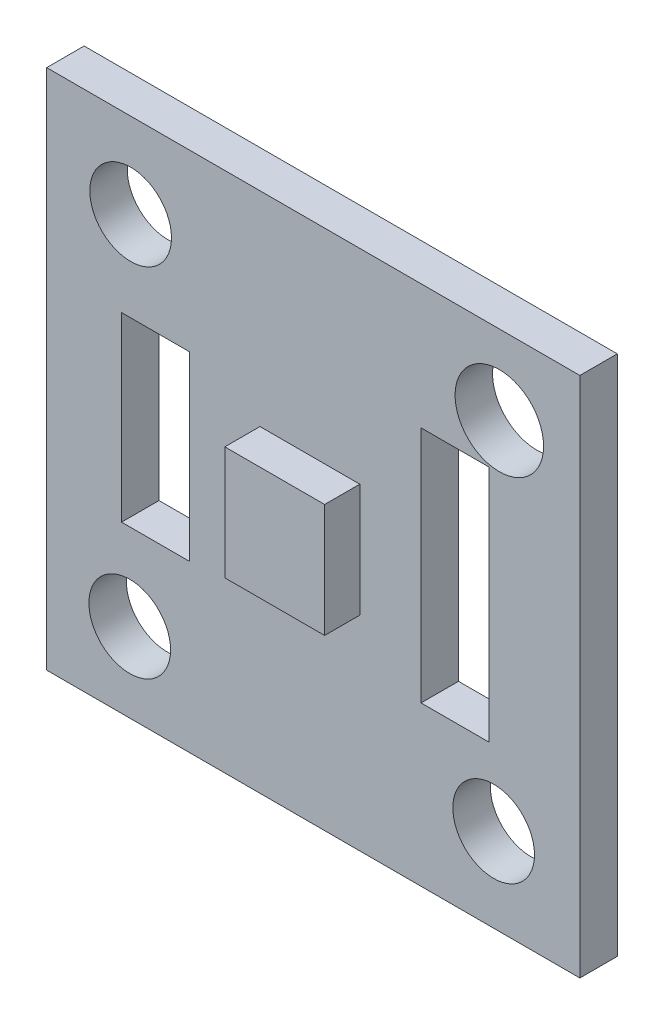
ISO-10303-21;
HEADER;
FILE_DESCRIPTION(('STEP AP214'),'2;1');
FILE_NAME('part.step','',(''),(''),'','','');
FILE_SCHEMA(('AUTOMOTIVE_DESIGN { 1 0 10303 214 1 1 1 1 }'));
ENDSEC;
DATA;
#1=APPLICATION_CONTEXT('core data for automotive mechanical design processes');
#2=APPLICATION_PROTOCOL_DEFINITION('international standard','automotive_design',2000,#1);
#3=PRODUCT_CONTEXT('',#1,'mechanical');
#4=PRODUCT('Part','Part','',(#3));
#5=PRODUCT_RELATED_PRODUCT_CATEGORY('part','',(#4));
#6=PRODUCT_DEFINITION_FORMATION('','',#4);
#7=PRODUCT_DEFINITION_CONTEXT('part definition',#1,'design');
#8=PRODUCT_DEFINITION('design','',#6,#7);
#9=PRODUCT_DEFINITION_SHAPE('','',#8);
#10=(LENGTH_UNIT() NAMED_UNIT(*) SI_UNIT(.MILLI.,.METRE.));
#11=(NAMED_UNIT(*) PLANE_ANGLE_UNIT() SI_UNIT($,.RADIAN.));
#12=(NAMED_UNIT(*) SI_UNIT($,.STERADIAN.) SOLID_ANGLE_UNIT());
#13=UNCERTAINTY_MEASURE_WITH_UNIT(LENGTH_MEASURE(1.E-05),#10,'distance_accuracy_value','');
#14=(GEOMETRIC_REPRESENTATION_CONTEXT(3) GLOBAL_UNCERTAINTY_ASSIGNED_CONTEXT((#13)) GLOBAL_UNIT_ASSIGNED_CONTEXT((#10,
#11,#12)) REPRESENTATION_CONTEXT('',''));
#15=CARTESIAN_POINT('',(0.,0.,0.));
#16=DIRECTION('',(0.,0.,1.));
#17=DIRECTION('',(1.,0.,0.));
#18=AXIS2_PLACEMENT_3D('',#15,#16,#17);
#19=CARTESIAN_POINT('',(0.,0.,1.65));
#20=DIRECTION('',(0.,0.,-1.));
#21=DIRECTION('',(-1.,0.,0.));
#22=AXIS2_PLACEMENT_3D('',#19,#20,#21);
#23=PLANE('',#22);
#24=CARTESIAN_POINT('',(3.65999999999999,3.5,1.65));
#25=DIRECTION('',(0.,0.,1.));
#26=DIRECTION('',(1.,0.,0.));
#27=AXIS2_PLACEMENT_3D('',#24,#25,#26);
#28=CIRCLE('',#27,1.8);
#29=CARTESIAN_POINT('',(5.45999999999999,3.5,1.65));
#30=VERTEX_POINT('',#29);
#31=EDGE_CURVE('E510',#30,#30,#28,.T.);
#32=ORIENTED_EDGE('',*,*,#31,.F.);
#33=EDGE_LOOP('',(#32));
#34=FACE_BOUND('',#33,.T.);
#35=CARTESIAN_POINT('',(19.7,3.7,1.65));
#36=DIRECTION('',(0.,0.,1.));
#37=DIRECTION('',(1.,0.,0.));
#38=AXIS2_PLACEMENT_3D('',#35,#36,#37);
#39=CIRCLE('',#38,1.8);
#40=CARTESIAN_POINT('',(21.5,3.7,1.65));
#41=VERTEX_POINT('',#40);
#42=EDGE_CURVE('E514',#41,#41,#39,.T.);
#43=ORIENTED_EDGE('',*,*,#42,.F.);
#44=EDGE_LOOP('',(#43));
#45=FACE_BOUND('',#44,.T.);
#46=CARTESIAN_POINT('',(19.95,19.5,1.65));
#47=DIRECTION('',(0.,0.,1.));
#48=DIRECTION('',(1.,0.,0.));
#49=AXIS2_PLACEMENT_3D('',#46,#47,#48);
#50=CIRCLE('',#49,1.95);
#51=CARTESIAN_POINT('',(21.9,19.5,1.65));
#52=VERTEX_POINT('',#51);
#53=EDGE_CURVE('E524',#52,#52,#50,.T.);
#54=ORIENTED_EDGE('',*,*,#53,.F.);
#55=EDGE_LOOP('',(#54));
#56=FACE_BOUND('',#55,.T.);
#57=CARTESIAN_POINT('',(3.69999999999999,19.25,1.65));
#58=DIRECTION('',(0.,0.,1.));
#59=DIRECTION('',(1.,0.,0.));
#60=AXIS2_PLACEMENT_3D('',#57,#58,#59);
#61=CIRCLE('',#60,1.8);
#62=CARTESIAN_POINT('',(5.49999999999999,19.25,1.65));
#63=VERTEX_POINT('',#62);
#64=EDGE_CURVE('E519',#63,#63,#61,.T.);
#65=ORIENTED_EDGE('',*,*,#64,.F.);
#66=EDGE_LOOP('',(#65));
#67=FACE_BOUND('',#66,.T.);
#68=DIRECTION('',(1.,0.,0.));
#69=VECTOR('',#68,1.);
#70=CARTESIAN_POINT('',(3.29999999999999,7.3,1.65));
#71=LINE('',#70,#69);
#72=CARTESIAN_POINT('',(3.29999999999999,7.3,1.65));
#73=VERTEX_POINT('',#72);
#74=CARTESIAN_POINT('',(6.29999999999999,7.3,1.65));
#75=VERTEX_POINT('',#74);
#76=EDGE_CURVE('E165',#73,#75,#71,.T.);
#77=ORIENTED_EDGE('',*,*,#76,.F.);
#78=DIRECTION('',(0.,-1.,0.));
#79=VECTOR('',#78,1.);
#80=CARTESIAN_POINT('',(3.29999999999999,15.3,1.65));
#81=LINE('',#80,#79);
#82=CARTESIAN_POINT('',(3.29999999999999,15.3,1.65));
#83=VERTEX_POINT('',#82);
#84=EDGE_CURVE('E48',#83,#73,#81,.T.);
#85=ORIENTED_EDGE('',*,*,#84,.F.);
#86=DIRECTION('',(-1.,0.,0.));
#87=VECTOR('',#86,1.);
#88=CARTESIAN_POINT('',(3.29999999999999,15.3,1.65));
#89=LINE('',#88,#87);
#90=CARTESIAN_POINT('',(6.29999999999999,15.3,1.65));
#91=VERTEX_POINT('',#90);
#92=EDGE_CURVE('E158',#91,#83,#89,.T.);
#93=ORIENTED_EDGE('',*,*,#92,.F.);
#94=DIRECTION('',(0.,1.,0.));
#95=VECTOR('',#94,1.);
#96=CARTESIAN_POINT('',(6.29999999999999,15.3,1.65));
#97=LINE('',#96,#95);
#98=EDGE_CURVE('E172',#75,#91,#97,.T.);
#99=ORIENTED_EDGE('',*,*,#98,.F.);
#100=EDGE_LOOP('',(#77,#85,#93,#99));
#101=FACE_BOUND('',#100,.T.);
#102=DIRECTION('',(1.,0.,0.));
#103=VECTOR('',#102,1.);
#104=CARTESIAN_POINT('',(16.5,7.,1.65));
#105=LINE('',#104,#103);
#106=CARTESIAN_POINT('',(16.5,7.,1.65));
#107=VERTEX_POINT('',#106);
#108=CARTESIAN_POINT('',(19.5,7.,1.65));
#109=VERTEX_POINT('',#108);
#110=EDGE_CURVE('E191',#107,#109,#105,.T.);
#111=ORIENTED_EDGE('',*,*,#110,.F.);
#112=DIRECTION('',(0.,-1.,0.));
#113=VECTOR('',#112,1.);
#114=CARTESIAN_POINT('',(16.5,17.5,1.65));
#115=LINE('',#114,#113);
#116=CARTESIAN_POINT('',(16.5,17.5,1.65));
#117=VERTEX_POINT('',#116);
#118=EDGE_CURVE('E189',#117,#107,#115,.T.);
#119=ORIENTED_EDGE('',*,*,#118,.F.);
#120=DIRECTION('',(-1.,0.,0.));
#121=VECTOR('',#120,1.);
#122=CARTESIAN_POINT('',(16.5,17.5,1.65));
#123=LINE('',#122,#121);
#124=CARTESIAN_POINT('',(19.5,17.5,1.65));
#125=VERTEX_POINT('',#124);
#126=EDGE_CURVE('E197',#125,#117,#123,.T.);
#127=ORIENTED_EDGE('',*,*,#126,.F.);
#128=DIRECTION('',(0.,1.,0.));
#129=VECTOR('',#128,1.);
#130=CARTESIAN_POINT('',(19.5,17.5,1.65));
#131=LINE('',#130,#129);
#132=EDGE_CURVE('E194',#109,#125,#131,.T.);
#133=ORIENTED_EDGE('',*,*,#132,.F.);
#134=EDGE_LOOP('',(#111,#119,#127,#133));
#135=FACE_BOUND('',#134,.T.);
#136=DIRECTION('',(0.,-1.,0.));
#137=VECTOR('',#136,1.);
#138=CARTESIAN_POINT('',(0.,0.,1.65));
#139=LINE('',#138,#137);
#140=CARTESIAN_POINT('',(0.,23.,1.65));
#141=VERTEX_POINT('',#140);
#142=CARTESIAN_POINT('',(0.,0.,1.65));
#143=VERTEX_POINT('',#142);
#144=EDGE_CURVE('E246',#141,#143,#139,.T.);
#145=ORIENTED_EDGE('',*,*,#144,.T.);
#146=DIRECTION('',(1.,0.,0.));
#147=VECTOR('',#146,1.);
#148=CARTESIAN_POINT('',(0.,0.,1.65));
#149=LINE('',#148,#147);
#150=CARTESIAN_POINT('',(23.5,0.,1.65));
#151=VERTEX_POINT('',#150);
#152=EDGE_CURVE('E249',#143,#151,#149,.T.);
#153=ORIENTED_EDGE('',*,*,#152,.T.);
#154=DIRECTION('',(0.,1.,0.));
#155=VECTOR('',#154,1.);
#156=CARTESIAN_POINT('',(23.5,0.,1.65));
#157=LINE('',#156,#155);
#158=CARTESIAN_POINT('',(23.5,23.,1.65));
#159=VERTEX_POINT('',#158);
#160=EDGE_CURVE('E252',#151,#159,#157,.T.);
#161=ORIENTED_EDGE('',*,*,#160,.T.);
#162=DIRECTION('',(-1.,0.,0.));
#163=VECTOR('',#162,1.);
#164=CARTESIAN_POINT('',(0.,23.,1.65));
#165=LINE('',#164,#163);
#166=EDGE_CURVE('E254',#159,#141,#165,.T.);
#167=ORIENTED_EDGE('',*,*,#166,.T.);
#168=EDGE_LOOP('',(#145,#153,#161,#167));
#169=FACE_BOUND('',#168,.T.);
#170=DIRECTION('',(0.,-1.,0.));
#171=VECTOR('',#170,1.);
#172=CARTESIAN_POINT('',(9.4,14.,1.65));
#173=LINE('',#172,#171);
#174=CARTESIAN_POINT('',(9.4,14.,1.65));
#175=VERTEX_POINT('',#174);
#176=CARTESIAN_POINT('',(9.4,9.,1.65));
#177=VERTEX_POINT('',#176);
#178=EDGE_CURVE('E212',#175,#177,#173,.T.);
#179=ORIENTED_EDGE('',*,*,#178,.F.);
#180=DIRECTION('',(-1.,0.,0.));
#181=VECTOR('',#180,1.);
#182=CARTESIAN_POINT('',(9.4,14.,1.65));
#183=LINE('',#182,#181);
#184=CARTESIAN_POINT('',(13.8,14.,1.65));
#185=VERTEX_POINT('',#184);
#186=EDGE_CURVE('E217',#185,#175,#183,.T.);
#187=ORIENTED_EDGE('',*,*,#186,.F.);
#188=DIRECTION('',(0.,1.,0.));
#189=VECTOR('',#188,1.);
#190=CARTESIAN_POINT('',(13.8,14.,1.65));
#191=LINE('',#190,#189);
#192=CARTESIAN_POINT('',(13.8,9.,1.65));
#193=VERTEX_POINT('',#192);
#194=EDGE_CURVE('E229',#193,#185,#191,.T.);
#195=ORIENTED_EDGE('',*,*,#194,.F.);
#196=DIRECTION('',(1.,0.,0.));
#197=VECTOR('',#196,1.);
#198=CARTESIAN_POINT('',(9.4,9.,1.65));
#199=LINE('',#198,#197);
#200=EDGE_CURVE('E226',#177,#193,#199,.T.);
#201=ORIENTED_EDGE('',*,*,#200,.F.);
#202=EDGE_LOOP('',(#179,#187,#195,#201));
#203=FACE_BOUND('',#202,.T.);
#204=ADVANCED_FACE('F33',(#34,#45,#56,#67,#101,#135,#169,#203),#23,.F.);
#205=CARTESIAN_POINT('',(0.,0.,1.65));
#206=DIRECTION('',(1.,0.,0.));
#207=DIRECTION('',(0.,1.,0.));
#208=AXIS2_PLACEMENT_3D('',#205,#206,#207);
#209=PLANE('',#208);
#210=DIRECTION('',(0.,-1.,0.));
#211=VECTOR('',#210,1.);
#212=CARTESIAN_POINT('',(0.,0.,0.));
#213=LINE('',#212,#211);
#214=CARTESIAN_POINT('',(0.,23.,0.));
#215=VERTEX_POINT('',#214);
#216=CARTESIAN_POINT('',(0.,0.,0.));
#217=VERTEX_POINT('',#216);
#218=EDGE_CURVE('E245',#215,#217,#213,.T.);
#219=ORIENTED_EDGE('',*,*,#218,.T.);
#220=DIRECTION('',(0.,0.,-1.));
#221=VECTOR('',#220,1.);
#222=CARTESIAN_POINT('',(0.,0.,1.65));
#223=LINE('',#222,#221);
#224=EDGE_CURVE('E11',#143,#217,#223,.T.);
#225=ORIENTED_EDGE('',*,*,#224,.F.);
#226=ORIENTED_EDGE('',*,*,#144,.F.);
#227=DIRECTION('',(0.,0.,-1.));
#228=VECTOR('',#227,1.);
#229=CARTESIAN_POINT('',(0.,23.,1.65));
#230=LINE('',#229,#228);
#231=EDGE_CURVE('E256',#141,#215,#230,.T.);
#232=ORIENTED_EDGE('',*,*,#231,.T.);
#233=EDGE_LOOP('',(#219,#225,#226,#232));
#234=FACE_BOUND('',#233,.T.);
#235=ADVANCED_FACE('F35',(#234),#209,.F.);
#236=CARTESIAN_POINT('',(0.,0.,1.65));
#237=DIRECTION('',(0.,1.,0.));
#238=DIRECTION('',(0.,0.,1.));
#239=AXIS2_PLACEMENT_3D('',#236,#237,#238);
#240=PLANE('',#239);
#241=DIRECTION('',(1.,0.,0.));
#242=VECTOR('',#241,1.);
#243=CARTESIAN_POINT('',(0.,0.,0.));
#244=LINE('',#243,#242);
#245=CARTESIAN_POINT('',(23.5,0.,0.));
#246=VERTEX_POINT('',#245);
#247=EDGE_CURVE('E259',#217,#246,#244,.T.);
#248=ORIENTED_EDGE('',*,*,#247,.T.);
#249=DIRECTION('',(0.,0.,-1.));
#250=VECTOR('',#249,1.);
#251=CARTESIAN_POINT('',(23.5,0.,1.65));
#252=LINE('',#251,#250);
#253=EDGE_CURVE('E41',#151,#246,#252,.T.);
#254=ORIENTED_EDGE('',*,*,#253,.F.);
#255=ORIENTED_EDGE('',*,*,#152,.F.);
#256=ORIENTED_EDGE('',*,*,#224,.T.);
#257=EDGE_LOOP('',(#248,#254,#255,#256));
#258=FACE_BOUND('',#257,.T.);
#259=ADVANCED_FACE('F288',(#258),#240,.F.);
#260=CARTESIAN_POINT('',(23.5,0.,1.65));
#261=DIRECTION('',(-1.,0.,0.));
#262=DIRECTION('',(0.,-1.,0.));
#263=AXIS2_PLACEMENT_3D('',#260,#261,#262);
#264=PLANE('',#263);
#265=DIRECTION('',(0.,1.,0.));
#266=VECTOR('',#265,1.);
#267=CARTESIAN_POINT('',(23.5,0.,0.));
#268=LINE('',#267,#266);
#269=CARTESIAN_POINT('',(23.5,23.,0.));
#270=VERTEX_POINT('',#269);
#271=EDGE_CURVE('E261',#246,#270,#268,.T.);
#272=ORIENTED_EDGE('',*,*,#271,.T.);
#273=DIRECTION('',(0.,0.,-1.));
#274=VECTOR('',#273,1.);
#275=CARTESIAN_POINT('',(23.5,23.,1.65));
#276=LINE('',#275,#274);
#277=EDGE_CURVE('E266',#159,#270,#276,.T.);
#278=ORIENTED_EDGE('',*,*,#277,.F.);
#279=ORIENTED_EDGE('',*,*,#160,.F.);
#280=ORIENTED_EDGE('',*,*,#253,.T.);
#281=EDGE_LOOP('',(#272,#278,#279,#280));
#282=FACE_BOUND('',#281,.T.);
#283=ADVANCED_FACE('F273',(#282),#264,.F.);
#284=CARTESIAN_POINT('',(0.,23.,1.65));
#285=DIRECTION('',(0.,-1.,0.));
#286=DIRECTION('',(0.,0.,-1.));
#287=AXIS2_PLACEMENT_3D('',#284,#285,#286);
#288=PLANE('',#287);
#289=DIRECTION('',(-1.,0.,0.));
#290=VECTOR('',#289,1.);
#291=CARTESIAN_POINT('',(0.,23.,0.));
#292=LINE('',#291,#290);
#293=EDGE_CURVE('E250',#270,#215,#292,.T.);
#294=ORIENTED_EDGE('',*,*,#293,.T.);
#295=ORIENTED_EDGE('',*,*,#231,.F.);
#296=ORIENTED_EDGE('',*,*,#166,.F.);
#297=ORIENTED_EDGE('',*,*,#277,.T.);
#298=EDGE_LOOP('',(#294,#295,#296,#297));
#299=FACE_BOUND('',#298,.T.);
#300=ADVANCED_FACE('F281',(#299),#288,.F.);
#301=CARTESIAN_POINT('',(0.,0.,0.));
#302=DIRECTION('',(0.,0.,-1.));
#303=DIRECTION('',(-1.,0.,0.));
#304=AXIS2_PLACEMENT_3D('',#301,#302,#303);
#305=PLANE('',#304);
#306=CARTESIAN_POINT('',(3.65999999999999,3.5,0.));
#307=DIRECTION('',(0.,0.,-1.));
#308=DIRECTION('',(-1.,0.,0.));
#309=AXIS2_PLACEMENT_3D('',#306,#307,#308);
#310=CIRCLE('',#309,1.8);
#311=CARTESIAN_POINT('',(5.45999999999999,3.5,0.));
#312=VERTEX_POINT('',#311);
#313=EDGE_CURVE('E508',#312,#312,#310,.F.);
#314=ORIENTED_EDGE('',*,*,#313,.T.);
#315=EDGE_LOOP('',(#314));
#316=FACE_BOUND('',#315,.T.);
#317=CARTESIAN_POINT('',(19.7,3.7,0.));
#318=DIRECTION('',(0.,0.,-1.));
#319=DIRECTION('',(-1.,0.,0.));
#320=AXIS2_PLACEMENT_3D('',#317,#318,#319);
#321=CIRCLE('',#320,1.8);
#322=CARTESIAN_POINT('',(21.5,3.7,0.));
#323=VERTEX_POINT('',#322);
#324=EDGE_CURVE('E511',#323,#323,#321,.F.);
#325=ORIENTED_EDGE('',*,*,#324,.T.);
#326=EDGE_LOOP('',(#325));
#327=FACE_BOUND('',#326,.T.);
#328=CARTESIAN_POINT('',(19.95,19.5,0.));
#329=DIRECTION('',(0.,0.,-1.));
#330=DIRECTION('',(-1.,0.,0.));
#331=AXIS2_PLACEMENT_3D('',#328,#329,#330);
#332=CIRCLE('',#331,1.95);
#333=CARTESIAN_POINT('',(21.9,19.5,0.));
#334=VERTEX_POINT('',#333);
#335=EDGE_CURVE('E541',#334,#334,#332,.F.);
#336=ORIENTED_EDGE('',*,*,#335,.T.);
#337=EDGE_LOOP('',(#336));
#338=FACE_BOUND('',#337,.T.);
#339=CARTESIAN_POINT('',(3.69999999999999,19.25,0.));
#340=DIRECTION('',(0.,0.,-1.));
#341=DIRECTION('',(-1.,0.,0.));
#342=AXIS2_PLACEMENT_3D('',#339,#340,#341);
#343=CIRCLE('',#342,1.8);
#344=CARTESIAN_POINT('',(5.49999999999999,19.25,0.));
#345=VERTEX_POINT('',#344);
#346=EDGE_CURVE('E522',#345,#345,#343,.F.);
#347=ORIENTED_EDGE('',*,*,#346,.T.);
#348=EDGE_LOOP('',(#347));
#349=FACE_BOUND('',#348,.T.);
#350=DIRECTION('',(0.,-1.,0.));
#351=VECTOR('',#350,1.);
#352=CARTESIAN_POINT('',(3.29999999999999,15.3,0.));
#353=LINE('',#352,#351);
#354=CARTESIAN_POINT('',(3.29999999999999,15.3,0.));
#355=VERTEX_POINT('',#354);
#356=CARTESIAN_POINT('',(3.29999999999999,7.3,0.));
#357=VERTEX_POINT('',#356);
#358=EDGE_CURVE('E156',#355,#357,#353,.T.);
#359=ORIENTED_EDGE('',*,*,#358,.T.);
#360=DIRECTION('',(1.,0.,0.));
#361=VECTOR('',#360,1.);
#362=CARTESIAN_POINT('',(3.29999999999999,7.3,0.));
#363=LINE('',#362,#361);
#364=CARTESIAN_POINT('',(6.29999999999999,7.3,0.));
#365=VERTEX_POINT('',#364);
#366=EDGE_CURVE('E145',#357,#365,#363,.T.);
#367=ORIENTED_EDGE('',*,*,#366,.T.);
#368=DIRECTION('',(0.,1.,0.));
#369=VECTOR('',#368,1.);
#370=CARTESIAN_POINT('',(6.29999999999999,15.3,0.));
#371=LINE('',#370,#369);
#372=CARTESIAN_POINT('',(6.29999999999999,15.3,0.));
#373=VERTEX_POINT('',#372);
#374=EDGE_CURVE('E167',#365,#373,#371,.T.);
#375=ORIENTED_EDGE('',*,*,#374,.T.);
#376=DIRECTION('',(-1.,0.,0.));
#377=VECTOR('',#376,1.);
#378=CARTESIAN_POINT('',(3.29999999999999,15.3,0.));
#379=LINE('',#378,#377);
#380=EDGE_CURVE('E163',#373,#355,#379,.T.);
#381=ORIENTED_EDGE('',*,*,#380,.T.);
#382=EDGE_LOOP('',(#359,#367,#375,#381));
#383=FACE_BOUND('',#382,.T.);
#384=DIRECTION('',(0.,-1.,0.));
#385=VECTOR('',#384,1.);
#386=CARTESIAN_POINT('',(16.5,17.5,0.));
#387=LINE('',#386,#385);
#388=CARTESIAN_POINT('',(16.5,17.5,0.));
#389=VERTEX_POINT('',#388);
#390=CARTESIAN_POINT('',(16.5,7.,0.));
#391=VERTEX_POINT('',#390);
#392=EDGE_CURVE('E186',#389,#391,#387,.T.);
#393=ORIENTED_EDGE('',*,*,#392,.T.);
#394=DIRECTION('',(1.,0.,0.));
#395=VECTOR('',#394,1.);
#396=CARTESIAN_POINT('',(16.5,7.,0.));
#397=LINE('',#396,#395);
#398=CARTESIAN_POINT('',(19.5,7.,0.));
#399=VERTEX_POINT('',#398);
#400=EDGE_CURVE('E203',#391,#399,#397,.T.);
#401=ORIENTED_EDGE('',*,*,#400,.T.);
#402=DIRECTION('',(0.,1.,0.));
#403=VECTOR('',#402,1.);
#404=CARTESIAN_POINT('',(19.5,17.5,0.));
#405=LINE('',#404,#403);
#406=CARTESIAN_POINT('',(19.5,17.5,0.));
#407=VERTEX_POINT('',#406);
#408=EDGE_CURVE('E152',#399,#407,#405,.T.);
#409=ORIENTED_EDGE('',*,*,#408,.T.);
#410=DIRECTION('',(-1.,0.,0.));
#411=VECTOR('',#410,1.);
#412=CARTESIAN_POINT('',(16.5,17.5,0.));
#413=LINE('',#412,#411);
#414=EDGE_CURVE('E183',#407,#389,#413,.T.);
#415=ORIENTED_EDGE('',*,*,#414,.T.);
#416=EDGE_LOOP('',(#393,#401,#409,#415));
#417=FACE_BOUND('',#416,.T.);
#418=ORIENTED_EDGE('',*,*,#218,.F.);
#419=ORIENTED_EDGE('',*,*,#293,.F.);
#420=ORIENTED_EDGE('',*,*,#271,.F.);
#421=ORIENTED_EDGE('',*,*,#247,.F.);
#422=EDGE_LOOP('',(#418,#419,#420,#421));
#423=FACE_BOUND('',#422,.T.);
#424=ADVANCED_FACE('F161',(#316,#327,#338,#349,#383,#417,#423),#305,.T.);
#425=CARTESIAN_POINT('',(9.4,14.,3.2));
#426=DIRECTION('',(1.,0.,0.));
#427=DIRECTION('',(0.,0.,-1.));
#428=AXIS2_PLACEMENT_3D('',#425,#426,#427);
#429=PLANE('',#428);
#430=ORIENTED_EDGE('',*,*,#178,.T.);
#431=DIRECTION('',(0.,0.,-1.));
#432=VECTOR('',#431,1.);
#433=CARTESIAN_POINT('',(9.4,9.,3.2));
#434=LINE('',#433,#432);
#435=CARTESIAN_POINT('',(9.4,9.,3.2));
#436=VERTEX_POINT('',#435);
#437=EDGE_CURVE('E242',#436,#177,#434,.T.);
#438=ORIENTED_EDGE('',*,*,#437,.F.);
#439=DIRECTION('',(0.,-1.,0.));
#440=VECTOR('',#439,1.);
#441=CARTESIAN_POINT('',(9.4,14.,3.2));
#442=LINE('',#441,#440);
#443=CARTESIAN_POINT('',(9.4,14.,3.2));
#444=VERTEX_POINT('',#443);
#445=EDGE_CURVE('E213',#444,#436,#442,.T.);
#446=ORIENTED_EDGE('',*,*,#445,.F.);
#447=DIRECTION('',(0.,0.,-1.));
#448=VECTOR('',#447,1.);
#449=CARTESIAN_POINT('',(9.4,14.,3.2));
#450=LINE('',#449,#448);
#451=EDGE_CURVE('E223',#444,#175,#450,.T.);
#452=ORIENTED_EDGE('',*,*,#451,.T.);
#453=EDGE_LOOP('',(#430,#438,#446,#452));
#454=FACE_BOUND('',#453,.T.);
#455=ADVANCED_FACE('F304',(#454),#429,.F.);
#456=CARTESIAN_POINT('',(9.4,9.,3.2));
#457=DIRECTION('',(0.,1.,0.));
#458=DIRECTION('',(0.,0.,1.));
#459=AXIS2_PLACEMENT_3D('',#456,#457,#458);
#460=PLANE('',#459);
#461=ORIENTED_EDGE('',*,*,#200,.T.);
#462=DIRECTION('',(0.,0.,-1.));
#463=VECTOR('',#462,1.);
#464=CARTESIAN_POINT('',(13.8,9.,3.2));
#465=LINE('',#464,#463);
#466=CARTESIAN_POINT('',(13.8,9.,3.2));
#467=VERTEX_POINT('',#466);
#468=EDGE_CURVE('E239',#467,#193,#465,.T.);
#469=ORIENTED_EDGE('',*,*,#468,.F.);
#470=DIRECTION('',(1.,0.,0.));
#471=VECTOR('',#470,1.);
#472=CARTESIAN_POINT('',(9.4,9.,3.2));
#473=LINE('',#472,#471);
#474=EDGE_CURVE('E216',#436,#467,#473,.T.);
#475=ORIENTED_EDGE('',*,*,#474,.F.);
#476=ORIENTED_EDGE('',*,*,#437,.T.);
#477=EDGE_LOOP('',(#461,#469,#475,#476));
#478=FACE_BOUND('',#477,.T.);
#479=ADVANCED_FACE('F325',(#478),#460,.F.);
#480=CARTESIAN_POINT('',(13.8,14.,3.2));
#481=DIRECTION('',(-1.,0.,0.));
#482=DIRECTION('',(0.,-1.,0.));
#483=AXIS2_PLACEMENT_3D('',#480,#481,#482);
#484=PLANE('',#483);
#485=ORIENTED_EDGE('',*,*,#194,.T.);
#486=DIRECTION('',(0.,0.,-1.));
#487=VECTOR('',#486,1.);
#488=CARTESIAN_POINT('',(13.8,14.,3.2));
#489=LINE('',#488,#487);
#490=CARTESIAN_POINT('',(13.8,14.,3.2));
#491=VERTEX_POINT('',#490);
#492=EDGE_CURVE('E236',#491,#185,#489,.T.);
#493=ORIENTED_EDGE('',*,*,#492,.F.);
#494=DIRECTION('',(0.,1.,0.));
#495=VECTOR('',#494,1.);
#496=CARTESIAN_POINT('',(13.8,14.,3.2));
#497=LINE('',#496,#495);
#498=EDGE_CURVE('E219',#467,#491,#497,.T.);
#499=ORIENTED_EDGE('',*,*,#498,.F.);
#500=ORIENTED_EDGE('',*,*,#468,.T.);
#501=EDGE_LOOP('',(#485,#493,#499,#500));
#502=FACE_BOUND('',#501,.T.);
#503=ADVANCED_FACE('F332',(#502),#484,.F.);
#504=CARTESIAN_POINT('',(9.4,14.,3.2));
#505=DIRECTION('',(0.,-1.,0.));
#506=DIRECTION('',(0.,0.,-1.));
#507=AXIS2_PLACEMENT_3D('',#504,#505,#506);
#508=PLANE('',#507);
#509=ORIENTED_EDGE('',*,*,#186,.T.);
#510=ORIENTED_EDGE('',*,*,#451,.F.);
#511=DIRECTION('',(-1.,0.,0.));
#512=VECTOR('',#511,1.);
#513=CARTESIAN_POINT('',(9.4,14.,3.2));
#514=LINE('',#513,#512);
#515=EDGE_CURVE('E221',#491,#444,#514,.T.);
#516=ORIENTED_EDGE('',*,*,#515,.F.);
#517=ORIENTED_EDGE('',*,*,#492,.T.);
#518=EDGE_LOOP('',(#509,#510,#516,#517));
#519=FACE_BOUND('',#518,.T.);
#520=ADVANCED_FACE('F339',(#519),#508,.F.);
#521=CARTESIAN_POINT('',(0.,0.,3.2));
#522=DIRECTION('',(0.,0.,1.));
#523=DIRECTION('',(1.,0.,0.));
#524=AXIS2_PLACEMENT_3D('',#521,#522,#523);
#525=PLANE('',#524);
#526=ORIENTED_EDGE('',*,*,#445,.T.);
#527=ORIENTED_EDGE('',*,*,#474,.T.);
#528=ORIENTED_EDGE('',*,*,#498,.T.);
#529=ORIENTED_EDGE('',*,*,#515,.T.);
#530=EDGE_LOOP('',(#526,#527,#528,#529));
#531=FACE_BOUND('',#530,.T.);
#532=ADVANCED_FACE('F347',(#531),#525,.T.);
#533=CARTESIAN_POINT('',(16.5,17.5,-0.000999999999999916));
#534=DIRECTION('',(-1.,0.,0.));
#535=DIRECTION('',(0.,0.,1.));
#536=AXIS2_PLACEMENT_3D('',#533,#534,#535);
#537=PLANE('',#536);
#538=DIRECTION('',(0.,0.,1.));
#539=VECTOR('',#538,1.);
#540=CARTESIAN_POINT('',(16.5,17.5,-0.000999999999999916));
#541=LINE('',#540,#539);
#542=EDGE_CURVE('E201',#389,#117,#541,.T.);
#543=ORIENTED_EDGE('',*,*,#542,.T.);
#544=ORIENTED_EDGE('',*,*,#118,.T.);
#545=DIRECTION('',(0.,0.,1.));
#546=VECTOR('',#545,1.);
#547=CARTESIAN_POINT('',(16.5,7.,-0.000999999999999916));
#548=LINE('',#547,#546);
#549=EDGE_CURVE('E200',#391,#107,#548,.T.);
#550=ORIENTED_EDGE('',*,*,#549,.F.);
#551=ORIENTED_EDGE('',*,*,#392,.F.);
#552=EDGE_LOOP('',(#543,#544,#550,#551));
#553=FACE_BOUND('',#552,.T.);
#554=ADVANCED_FACE('F355',(#553),#537,.F.);
#555=CARTESIAN_POINT('',(16.5,17.5,-0.000999999999999916));
#556=DIRECTION('',(0.,1.,0.));
#557=DIRECTION('',(0.,0.,1.));
#558=AXIS2_PLACEMENT_3D('',#555,#556,#557);
#559=PLANE('',#558);
#560=DIRECTION('',(0.,0.,1.));
#561=VECTOR('',#560,1.);
#562=CARTESIAN_POINT('',(19.5,17.5,-0.000999999999999916));
#563=LINE('',#562,#561);
#564=EDGE_CURVE('E204',#407,#125,#563,.T.);
#565=ORIENTED_EDGE('',*,*,#564,.T.);
#566=ORIENTED_EDGE('',*,*,#126,.T.);
#567=ORIENTED_EDGE('',*,*,#542,.F.);
#568=ORIENTED_EDGE('',*,*,#414,.F.);
#569=EDGE_LOOP('',(#565,#566,#567,#568));
#570=FACE_BOUND('',#569,.T.);
#571=ADVANCED_FACE('F363',(#570),#559,.F.);
#572=CARTESIAN_POINT('',(19.5,17.5,-0.000999999999999916));
#573=DIRECTION('',(1.,0.,0.));
#574=DIRECTION('',(0.,0.,-1.));
#575=AXIS2_PLACEMENT_3D('',#572,#573,#574);
#576=PLANE('',#575);
#577=DIRECTION('',(0.,0.,1.));
#578=VECTOR('',#577,1.);
#579=CARTESIAN_POINT('',(19.5,7.,-0.000999999999999916));
#580=LINE('',#579,#578);
#581=EDGE_CURVE('E206',#399,#109,#580,.T.);
#582=ORIENTED_EDGE('',*,*,#581,.T.);
#583=ORIENTED_EDGE('',*,*,#132,.T.);
#584=ORIENTED_EDGE('',*,*,#564,.F.);
#585=ORIENTED_EDGE('',*,*,#408,.F.);
#586=EDGE_LOOP('',(#582,#583,#584,#585));
#587=FACE_BOUND('',#586,.T.);
#588=ADVANCED_FACE('F371',(#587),#576,.F.);
#589=CARTESIAN_POINT('',(16.5,7.,-0.000999999999999916));
#590=DIRECTION('',(0.,-1.,0.));
#591=DIRECTION('',(0.,0.,-1.));
#592=AXIS2_PLACEMENT_3D('',#589,#590,#591);
#593=PLANE('',#592);
#594=ORIENTED_EDGE('',*,*,#549,.T.);
#595=ORIENTED_EDGE('',*,*,#110,.T.);
#596=ORIENTED_EDGE('',*,*,#581,.F.);
#597=ORIENTED_EDGE('',*,*,#400,.F.);
#598=EDGE_LOOP('',(#594,#595,#596,#597));
#599=FACE_BOUND('',#598,.T.);
#600=ADVANCED_FACE('F379',(#599),#593,.F.);
#601=CARTESIAN_POINT('',(3.29999999999999,15.3,-0.000999999999999916));
#602=DIRECTION('',(-1.,0.,0.));
#603=DIRECTION('',(0.,-1.,0.));
#604=AXIS2_PLACEMENT_3D('',#601,#602,#603);
#605=PLANE('',#604);
#606=DIRECTION('',(0.,0.,1.));
#607=VECTOR('',#606,1.);
#608=CARTESIAN_POINT('',(3.29999999999999,15.3,-0.000999999999999916));
#609=LINE('',#608,#607);
#610=EDGE_CURVE('E153',#355,#83,#609,.T.);
#611=ORIENTED_EDGE('',*,*,#610,.T.);
#612=ORIENTED_EDGE('',*,*,#84,.T.);
#613=DIRECTION('',(0.,0.,1.));
#614=VECTOR('',#613,1.);
#615=CARTESIAN_POINT('',(3.29999999999999,7.3,-0.000999999999999916));
#616=LINE('',#615,#614);
#617=EDGE_CURVE('E147',#357,#73,#616,.T.);
#618=ORIENTED_EDGE('',*,*,#617,.F.);
#619=ORIENTED_EDGE('',*,*,#358,.F.);
#620=EDGE_LOOP('',(#611,#612,#618,#619));
#621=FACE_BOUND('',#620,.T.);
#622=ADVANCED_FACE('F155',(#621),#605,.F.);
#623=CARTESIAN_POINT('',(3.29999999999999,15.3,-0.000999999999999916));
#624=DIRECTION('',(0.,1.,0.));
#625=DIRECTION('',(0.,0.,1.));
#626=AXIS2_PLACEMENT_3D('',#623,#624,#625);
#627=PLANE('',#626);
#628=DIRECTION('',(0.,0.,1.));
#629=VECTOR('',#628,1.);
#630=CARTESIAN_POINT('',(6.29999999999999,15.3,-0.000999999999999916));
#631=LINE('',#630,#629);
#632=EDGE_CURVE('E178',#373,#91,#631,.T.);
#633=ORIENTED_EDGE('',*,*,#632,.T.);
#634=ORIENTED_EDGE('',*,*,#92,.T.);
#635=ORIENTED_EDGE('',*,*,#610,.F.);
#636=ORIENTED_EDGE('',*,*,#380,.F.);
#637=EDGE_LOOP('',(#633,#634,#635,#636));
#638=FACE_BOUND('',#637,.T.);
#639=ADVANCED_FACE('F394',(#638),#627,.F.);
#640=CARTESIAN_POINT('',(6.29999999999999,15.3,-0.000999999999999916));
#641=DIRECTION('',(1.,0.,0.));
#642=DIRECTION('',(0.,1.,0.));
#643=AXIS2_PLACEMENT_3D('',#640,#641,#642);
#644=PLANE('',#643);
#645=DIRECTION('',(0.,0.,1.));
#646=VECTOR('',#645,1.);
#647=CARTESIAN_POINT('',(6.29999999999999,7.3,-0.000999999999999916));
#648=LINE('',#647,#646);
#649=EDGE_CURVE('E56',#365,#75,#648,.T.);
#650=ORIENTED_EDGE('',*,*,#649,.T.);
#651=ORIENTED_EDGE('',*,*,#98,.T.);
#652=ORIENTED_EDGE('',*,*,#632,.F.);
#653=ORIENTED_EDGE('',*,*,#374,.F.);
#654=EDGE_LOOP('',(#650,#651,#652,#653));
#655=FACE_BOUND('',#654,.T.);
#656=ADVANCED_FACE('F401',(#655),#644,.F.);
#657=CARTESIAN_POINT('',(3.29999999999999,7.3,-0.000999999999999916));
#658=DIRECTION('',(0.,-1.,0.));
#659=DIRECTION('',(0.,0.,-1.));
#660=AXIS2_PLACEMENT_3D('',#657,#658,#659);
#661=PLANE('',#660);
#662=ORIENTED_EDGE('',*,*,#617,.T.);
#663=ORIENTED_EDGE('',*,*,#76,.T.);
#664=ORIENTED_EDGE('',*,*,#649,.F.);
#665=ORIENTED_EDGE('',*,*,#366,.F.);
#666=EDGE_LOOP('',(#662,#663,#664,#665));
#667=FACE_BOUND('',#666,.T.);
#668=ADVANCED_FACE('F146',(#667),#661,.F.);
#669=CARTESIAN_POINT('',(3.69999999999999,19.25,-0.000999999999999916));
#670=DIRECTION('',(0.,0.,1.));
#671=DIRECTION('',(1.,0.,0.));
#672=AXIS2_PLACEMENT_3D('',#669,#670,#671);
#673=CYLINDRICAL_SURFACE('',#672,1.8);
#674=CARTESIAN_POINT('',(5.49999999999999,19.25,0.));
#675=CARTESIAN_POINT('',(5.49999999999999,19.25,0.0171875));
#676=CARTESIAN_POINT('',(5.49999999999999,19.25,0.034375));
#677=CARTESIAN_POINT('',(5.49999999999999,19.25,0.06875));
#678=CARTESIAN_POINT('',(5.49999999999999,19.25,0.0859375));
#679=CARTESIAN_POINT('',(5.49999999999999,19.25,0.1203125));
#680=CARTESIAN_POINT('',(5.49999999999999,19.25,0.1375));
#681=CARTESIAN_POINT('',(5.49999999999999,19.25,0.171875));
#682=CARTESIAN_POINT('',(5.49999999999999,19.25,0.1890625));
#683=CARTESIAN_POINT('',(5.49999999999999,19.25,0.2234375));
#684=CARTESIAN_POINT('',(5.49999999999999,19.25,0.240625));
#685=CARTESIAN_POINT('',(5.49999999999999,19.25,0.275));
#686=CARTESIAN_POINT('',(5.49999999999999,19.25,0.2921875));
#687=CARTESIAN_POINT('',(5.49999999999999,19.25,0.3265625));
#688=CARTESIAN_POINT('',(5.49999999999999,19.25,0.34375));
#689=CARTESIAN_POINT('',(5.49999999999999,19.25,0.378125));
#690=CARTESIAN_POINT('',(5.49999999999999,19.25,0.3953125));
#691=CARTESIAN_POINT('',(5.49999999999999,19.25,0.4296875));
#692=CARTESIAN_POINT('',(5.49999999999999,19.25,0.446875));
#693=CARTESIAN_POINT('',(5.49999999999999,19.25,0.48125));
#694=CARTESIAN_POINT('',(5.49999999999999,19.25,0.4984375));
#695=CARTESIAN_POINT('',(5.49999999999999,19.25,0.5328125));
#696=CARTESIAN_POINT('',(5.49999999999999,19.25,0.55));
#697=CARTESIAN_POINT('',(5.49999999999999,19.25,0.584375));
#698=CARTESIAN_POINT('',(5.49999999999999,19.25,0.6015625));
#699=CARTESIAN_POINT('',(5.49999999999999,19.25,0.6359375));
#700=CARTESIAN_POINT('',(5.49999999999999,19.25,0.653125));
#701=CARTESIAN_POINT('',(5.49999999999999,19.25,0.6875));
#702=CARTESIAN_POINT('',(5.49999999999999,19.25,0.7046875));
#703=CARTESIAN_POINT('',(5.49999999999999,19.25,0.7390625));
#704=CARTESIAN_POINT('',(5.49999999999999,19.25,0.75625));
#705=CARTESIAN_POINT('',(5.49999999999999,19.25,0.790625));
#706=CARTESIAN_POINT('',(5.49999999999999,19.25,0.8078125));
#707=CARTESIAN_POINT('',(5.49999999999999,19.25,0.8421875));
#708=CARTESIAN_POINT('',(5.49999999999999,19.25,0.859375));
#709=CARTESIAN_POINT('',(5.49999999999999,19.25,0.89375));
#710=CARTESIAN_POINT('',(5.49999999999999,19.25,0.9109375));
#711=CARTESIAN_POINT('',(5.49999999999999,19.25,0.9453125));
#712=CARTESIAN_POINT('',(5.49999999999999,19.25,0.9625));
#713=CARTESIAN_POINT('',(5.49999999999999,19.25,0.996875));
#714=CARTESIAN_POINT('',(5.49999999999999,19.25,1.0140625));
#715=CARTESIAN_POINT('',(5.49999999999999,19.25,1.0484375));
#716=CARTESIAN_POINT('',(5.49999999999999,19.25,1.065625));
#717=CARTESIAN_POINT('',(5.49999999999999,19.25,1.1));
#718=CARTESIAN_POINT('',(5.49999999999999,19.25,1.1171875));
#719=CARTESIAN_POINT('',(5.49999999999999,19.25,1.1515625));
#720=CARTESIAN_POINT('',(5.49999999999999,19.25,1.16875));
#721=CARTESIAN_POINT('',(5.49999999999999,19.25,1.203125));
#722=CARTESIAN_POINT('',(5.49999999999999,19.25,1.2203125));
#723=CARTESIAN_POINT('',(5.49999999999999,19.25,1.2546875));
#724=CARTESIAN_POINT('',(5.49999999999999,19.25,1.271875));
#725=CARTESIAN_POINT('',(5.49999999999999,19.25,1.30625));
#726=CARTESIAN_POINT('',(5.49999999999999,19.25,1.3234375));
#727=CARTESIAN_POINT('',(5.49999999999999,19.25,1.3578125));
#728=CARTESIAN_POINT('',(5.49999999999999,19.25,1.375));
#729=CARTESIAN_POINT('',(5.49999999999999,19.25,1.409375));
#730=CARTESIAN_POINT('',(5.49999999999999,19.25,1.4265625));
#731=CARTESIAN_POINT('',(5.49999999999999,19.25,1.4609375));
#732=CARTESIAN_POINT('',(5.49999999999999,19.25,1.478125));
#733=CARTESIAN_POINT('',(5.49999999999999,19.25,1.5125));
#734=CARTESIAN_POINT('',(5.49999999999999,19.25,1.5296875));
#735=CARTESIAN_POINT('',(5.49999999999999,19.25,1.5640625));
#736=CARTESIAN_POINT('',(5.49999999999999,19.25,1.58125));
#737=CARTESIAN_POINT('',(5.49999999999999,19.25,1.615625));
#738=CARTESIAN_POINT('',(5.49999999999999,19.25,1.6328125));
#739=CARTESIAN_POINT('',(5.49999999999999,19.25,1.65));
#740=B_SPLINE_CURVE_WITH_KNOTS('',3,(#674,#675,#676,#677,#678,#679,#680,#681,#682,#683,#684,
#685,#686,#687,#688,#689,#690,#691,#692,#693,#694,#695,#696,#697,#698,#699,#700,#701,#702,#703,
#704,#705,#706,#707,#708,#709,#710,#711,#712,#713,#714,#715,#716,#717,#718,#719,#720,#721,#722,
#723,#724,#725,#726,#727,#728,#729,#730,#731,#732,#733,#734,#735,#736,#737,#738,#739),
.UNSPECIFIED.,.F.,.F.,(4,2,2,2,2,2,2,2,2,2,2,2,2,2,2,2,2,2,2,2,2,2,2,2,2,2,2,2,2,2,2,2,4),(0.,
0.0515625,0.103125,0.1546875,0.20625,0.2578125,0.309375,0.3609375,0.4125,0.4640625,0.515625,
0.5671875,0.61875,0.6703125,0.721875,0.7734375,0.825,0.8765625,0.928125,0.9796875,1.03125,
1.0828125,1.134375,1.1859375,1.2375,1.2890625,1.340625,1.3921875,1.44375,1.4953125,1.546875,
1.5984375,1.65),.UNSPECIFIED.);
#741=EDGE_CURVE('BSEAM416',#345,#63,#740,.T.);
#742=ORIENTED_EDGE('',*,*,#346,.F.);
#743=ORIENTED_EDGE('',*,*,#64,.T.);
#744=ORIENTED_EDGE('',*,*,#741,.T.);
#745=ORIENTED_EDGE('',*,*,#741,.F.);
#746=EDGE_LOOP('',(#742,#744,#743,#745));
#747=FACE_BOUND('',#746,.T.);
#748=ADVANCED_FACE('F416',(#747),#673,.F.);
#749=CARTESIAN_POINT('',(19.95,19.5,-0.000999999999999916));
#750=DIRECTION('',(0.,0.,1.));
#751=DIRECTION('',(1.,0.,0.));
#752=AXIS2_PLACEMENT_3D('',#749,#750,#751);
#753=CYLINDRICAL_SURFACE('',#752,1.95);
#754=CARTESIAN_POINT('',(21.9,19.5,0.));
#755=CARTESIAN_POINT('',(21.9,19.5,0.0171875));
#756=CARTESIAN_POINT('',(21.9,19.5,0.034375));
#757=CARTESIAN_POINT('',(21.9,19.5,0.06875));
#758=CARTESIAN_POINT('',(21.9,19.5,0.0859375));
#759=CARTESIAN_POINT('',(21.9,19.5,0.1203125));
#760=CARTESIAN_POINT('',(21.9,19.5,0.1375));
#761=CARTESIAN_POINT('',(21.9,19.5,0.171875));
#762=CARTESIAN_POINT('',(21.9,19.5,0.1890625));
#763=CARTESIAN_POINT('',(21.9,19.5,0.2234375));
#764=CARTESIAN_POINT('',(21.9,19.5,0.240625));
#765=CARTESIAN_POINT('',(21.9,19.5,0.275));
#766=CARTESIAN_POINT('',(21.9,19.5,0.2921875));
#767=CARTESIAN_POINT('',(21.9,19.5,0.3265625));
#768=CARTESIAN_POINT('',(21.9,19.5,0.34375));
#769=CARTESIAN_POINT('',(21.9,19.5,0.378125));
#770=CARTESIAN_POINT('',(21.9,19.5,0.3953125));
#771=CARTESIAN_POINT('',(21.9,19.5,0.4296875));
#772=CARTESIAN_POINT('',(21.9,19.5,0.446875));
#773=CARTESIAN_POINT('',(21.9,19.5,0.48125));
#774=CARTESIAN_POINT('',(21.9,19.5,0.4984375));
#775=CARTESIAN_POINT('',(21.9,19.5,0.5328125));
#776=CARTESIAN_POINT('',(21.9,19.5,0.55));
#777=CARTESIAN_POINT('',(21.9,19.5,0.584375));
#778=CARTESIAN_POINT('',(21.9,19.5,0.6015625));
#779=CARTESIAN_POINT('',(21.9,19.5,0.6359375));
#780=CARTESIAN_POINT('',(21.9,19.5,0.653125));
#781=CARTESIAN_POINT('',(21.9,19.5,0.6875));
#782=CARTESIAN_POINT('',(21.9,19.5,0.7046875));
#783=CARTESIAN_POINT('',(21.9,19.5,0.7390625));
#784=CARTESIAN_POINT('',(21.9,19.5,0.75625));
#785=CARTESIAN_POINT('',(21.9,19.5,0.790625));
#786=CARTESIAN_POINT('',(21.9,19.5,0.8078125));
#787=CARTESIAN_POINT('',(21.9,19.5,0.8421875));
#788=CARTESIAN_POINT('',(21.9,19.5,0.859375));
#789=CARTESIAN_POINT('',(21.9,19.5,0.89375));
#790=CARTESIAN_POINT('',(21.9,19.5,0.9109375));
#791=CARTESIAN_POINT('',(21.9,19.5,0.9453125));
#792=CARTESIAN_POINT('',(21.9,19.5,0.9625));
#793=CARTESIAN_POINT('',(21.9,19.5,0.996875));
#794=CARTESIAN_POINT('',(21.9,19.5,1.0140625));
#795=CARTESIAN_POINT('',(21.9,19.5,1.0484375));
#796=CARTESIAN_POINT('',(21.9,19.5,1.065625));
#797=CARTESIAN_POINT('',(21.9,19.5,1.1));
#798=CARTESIAN_POINT('',(21.9,19.5,1.1171875));
#799=CARTESIAN_POINT('',(21.9,19.5,1.1515625));
#800=CARTESIAN_POINT('',(21.9,19.5,1.16875));
#801=CARTESIAN_POINT('',(21.9,19.5,1.203125));
#802=CARTESIAN_POINT('',(21.9,19.5,1.2203125));
#803=CARTESIAN_POINT('',(21.9,19.5,1.2546875));
#804=CARTESIAN_POINT('',(21.9,19.5,1.271875));
#805=CARTESIAN_POINT('',(21.9,19.5,1.30625));
#806=CARTESIAN_POINT('',(21.9,19.5,1.3234375));
#807=CARTESIAN_POINT('',(21.9,19.5,1.3578125));
#808=CARTESIAN_POINT('',(21.9,19.5,1.375));
#809=CARTESIAN_POINT('',(21.9,19.5,1.409375));
#810=CARTESIAN_POINT('',(21.9,19.5,1.4265625));
#811=CARTESIAN_POINT('',(21.9,19.5,1.4609375));
#812=CARTESIAN_POINT('',(21.9,19.5,1.478125));
#813=CARTESIAN_POINT('',(21.9,19.5,1.5125));
#814=CARTESIAN_POINT('',(21.9,19.5,1.5296875));
#815=CARTESIAN_POINT('',(21.9,19.5,1.5640625));
#816=CARTESIAN_POINT('',(21.9,19.5,1.58125));
#817=CARTESIAN_POINT('',(21.9,19.5,1.615625));
#818=CARTESIAN_POINT('',(21.9,19.5,1.6328125));
#819=CARTESIAN_POINT('',(21.9,19.5,1.65));
#820=B_SPLINE_CURVE_WITH_KNOTS('',3,(#754,#755,#756,#757,#758,#759,#760,#761,#762,#763,#764,
#765,#766,#767,#768,#769,#770,#771,#772,#773,#774,#775,#776,#777,#778,#779,#780,#781,#782,#783,
#784,#785,#786,#787,#788,#789,#790,#791,#792,#793,#794,#795,#796,#797,#798,#799,#800,#801,#802,
#803,#804,#805,#806,#807,#808,#809,#810,#811,#812,#813,#814,#815,#816,#817,#818,#819),
.UNSPECIFIED.,.F.,.F.,(4,2,2,2,2,2,2,2,2,2,2,2,2,2,2,2,2,2,2,2,2,2,2,2,2,2,2,2,2,2,2,2,4),(0.,
0.0515625,0.103125,0.1546875,0.20625,0.2578125,0.309375,0.3609375,0.4125,0.4640625,0.515625,
0.5671875,0.61875,0.6703125,0.721875,0.7734375,0.825,0.8765625,0.928125,0.9796875,1.03125,
1.0828125,1.134375,1.1859375,1.2375,1.2890625,1.340625,1.3921875,1.44375,1.4953125,1.546875,
1.5984375,1.65),.UNSPECIFIED.);
#821=EDGE_CURVE('BSEAM422',#334,#52,#820,.T.);
#822=ORIENTED_EDGE('',*,*,#335,.F.);
#823=ORIENTED_EDGE('',*,*,#53,.T.);
#824=ORIENTED_EDGE('',*,*,#821,.T.);
#825=ORIENTED_EDGE('',*,*,#821,.F.);
#826=EDGE_LOOP('',(#822,#824,#823,#825));
#827=FACE_BOUND('',#826,.T.);
#828=ADVANCED_FACE('F422',(#827),#753,.F.);
#829=CARTESIAN_POINT('',(19.7,3.7,-0.000999999999999916));
#830=DIRECTION('',(0.,0.,1.));
#831=DIRECTION('',(1.,0.,0.));
#832=AXIS2_PLACEMENT_3D('',#829,#830,#831);
#833=CYLINDRICAL_SURFACE('',#832,1.8);
#834=CARTESIAN_POINT('',(21.5,3.7,0.));
#835=CARTESIAN_POINT('',(21.5,3.7,0.0171875));
#836=CARTESIAN_POINT('',(21.5,3.7,0.034375));
#837=CARTESIAN_POINT('',(21.5,3.7,0.06875));
#838=CARTESIAN_POINT('',(21.5,3.7,0.0859375));
#839=CARTESIAN_POINT('',(21.5,3.7,0.1203125));
#840=CARTESIAN_POINT('',(21.5,3.7,0.1375));
#841=CARTESIAN_POINT('',(21.5,3.7,0.171875));
#842=CARTESIAN_POINT('',(21.5,3.7,0.1890625));
#843=CARTESIAN_POINT('',(21.5,3.7,0.2234375));
#844=CARTESIAN_POINT('',(21.5,3.7,0.240625));
#845=CARTESIAN_POINT('',(21.5,3.7,0.275));
#846=CARTESIAN_POINT('',(21.5,3.7,0.2921875));
#847=CARTESIAN_POINT('',(21.5,3.7,0.3265625));
#848=CARTESIAN_POINT('',(21.5,3.7,0.34375));
#849=CARTESIAN_POINT('',(21.5,3.7,0.378125));
#850=CARTESIAN_POINT('',(21.5,3.7,0.3953125));
#851=CARTESIAN_POINT('',(21.5,3.7,0.4296875));
#852=CARTESIAN_POINT('',(21.5,3.7,0.446875));
#853=CARTESIAN_POINT('',(21.5,3.7,0.48125));
#854=CARTESIAN_POINT('',(21.5,3.7,0.4984375));
#855=CARTESIAN_POINT('',(21.5,3.7,0.5328125));
#856=CARTESIAN_POINT('',(21.5,3.7,0.55));
#857=CARTESIAN_POINT('',(21.5,3.7,0.584375));
#858=CARTESIAN_POINT('',(21.5,3.7,0.6015625));
#859=CARTESIAN_POINT('',(21.5,3.7,0.6359375));
#860=CARTESIAN_POINT('',(21.5,3.7,0.653125));
#861=CARTESIAN_POINT('',(21.5,3.7,0.6875));
#862=CARTESIAN_POINT('',(21.5,3.7,0.7046875));
#863=CARTESIAN_POINT('',(21.5,3.7,0.7390625));
#864=CARTESIAN_POINT('',(21.5,3.7,0.75625));
#865=CARTESIAN_POINT('',(21.5,3.7,0.790625));
#866=CARTESIAN_POINT('',(21.5,3.7,0.8078125));
#867=CARTESIAN_POINT('',(21.5,3.7,0.8421875));
#868=CARTESIAN_POINT('',(21.5,3.7,0.859375));
#869=CARTESIAN_POINT('',(21.5,3.7,0.89375));
#870=CARTESIAN_POINT('',(21.5,3.7,0.9109375));
#871=CARTESIAN_POINT('',(21.5,3.7,0.9453125));
#872=CARTESIAN_POINT('',(21.5,3.7,0.9625));
#873=CARTESIAN_POINT('',(21.5,3.7,0.996875));
#874=CARTESIAN_POINT('',(21.5,3.7,1.0140625));
#875=CARTESIAN_POINT('',(21.5,3.7,1.0484375));
#876=CARTESIAN_POINT('',(21.5,3.7,1.065625));
#877=CARTESIAN_POINT('',(21.5,3.7,1.1));
#878=CARTESIAN_POINT('',(21.5,3.7,1.1171875));
#879=CARTESIAN_POINT('',(21.5,3.7,1.1515625));
#880=CARTESIAN_POINT('',(21.5,3.7,1.16875));
#881=CARTESIAN_POINT('',(21.5,3.7,1.203125));
#882=CARTESIAN_POINT('',(21.5,3.7,1.2203125));
#883=CARTESIAN_POINT('',(21.5,3.7,1.2546875));
#884=CARTESIAN_POINT('',(21.5,3.7,1.271875));
#885=CARTESIAN_POINT('',(21.5,3.7,1.30625));
#886=CARTESIAN_POINT('',(21.5,3.7,1.3234375));
#887=CARTESIAN_POINT('',(21.5,3.7,1.3578125));
#888=CARTESIAN_POINT('',(21.5,3.7,1.375));
#889=CARTESIAN_POINT('',(21.5,3.7,1.409375));
#890=CARTESIAN_POINT('',(21.5,3.7,1.4265625));
#891=CARTESIAN_POINT('',(21.5,3.7,1.4609375));
#892=CARTESIAN_POINT('',(21.5,3.7,1.478125));
#893=CARTESIAN_POINT('',(21.5,3.7,1.5125));
#894=CARTESIAN_POINT('',(21.5,3.7,1.5296875));
#895=CARTESIAN_POINT('',(21.5,3.7,1.5640625));
#896=CARTESIAN_POINT('',(21.5,3.7,1.58125));
#897=CARTESIAN_POINT('',(21.5,3.7,1.615625));
#898=CARTESIAN_POINT('',(21.5,3.7,1.6328125));
#899=CARTESIAN_POINT('',(21.5,3.7,1.65));
#900=B_SPLINE_CURVE_WITH_KNOTS('',3,(#834,#835,#836,#837,#838,#839,#840,#841,#842,#843,#844,
#845,#846,#847,#848,#849,#850,#851,#852,#853,#854,#855,#856,#857,#858,#859,#860,#861,#862,#863,
#864,#865,#866,#867,#868,#869,#870,#871,#872,#873,#874,#875,#876,#877,#878,#879,#880,#881,#882,
#883,#884,#885,#886,#887,#888,#889,#890,#891,#892,#893,#894,#895,#896,#897,#898,#899),
.UNSPECIFIED.,.F.,.F.,(4,2,2,2,2,2,2,2,2,2,2,2,2,2,2,2,2,2,2,2,2,2,2,2,2,2,2,2,2,2,2,2,4),(0.,
0.0515625,0.103125,0.1546875,0.20625,0.2578125,0.309375,0.3609375,0.4125,0.4640625,0.515625,
0.5671875,0.61875,0.6703125,0.721875,0.7734375,0.825,0.8765625,0.928125,0.9796875,1.03125,
1.0828125,1.134375,1.1859375,1.2375,1.2890625,1.340625,1.3921875,1.44375,1.4953125,1.546875,
1.5984375,1.65),.UNSPECIFIED.);
#901=EDGE_CURVE('BSEAM430',#323,#41,#900,.T.);
#902=ORIENTED_EDGE('',*,*,#324,.F.);
#903=ORIENTED_EDGE('',*,*,#42,.T.);
#904=ORIENTED_EDGE('',*,*,#901,.T.);
#905=ORIENTED_EDGE('',*,*,#901,.F.);
#906=EDGE_LOOP('',(#902,#904,#903,#905));
#907=FACE_BOUND('',#906,.T.);
#908=ADVANCED_FACE('F430',(#907),#833,.F.);
#909=CARTESIAN_POINT('',(3.65999999999999,3.5,-0.000999999999999916));
#910=DIRECTION('',(0.,0.,1.));
#911=DIRECTION('',(1.,0.,0.));
#912=AXIS2_PLACEMENT_3D('',#909,#910,#911);
#913=CYLINDRICAL_SURFACE('',#912,1.8);
#914=CARTESIAN_POINT('',(5.45999999999999,3.5,0.));
#915=CARTESIAN_POINT('',(5.45999999999999,3.5,0.0171875));
#916=CARTESIAN_POINT('',(5.45999999999999,3.5,0.034375));
#917=CARTESIAN_POINT('',(5.45999999999999,3.5,0.06875));
#918=CARTESIAN_POINT('',(5.45999999999999,3.5,0.0859375));
#919=CARTESIAN_POINT('',(5.45999999999999,3.5,0.1203125));
#920=CARTESIAN_POINT('',(5.45999999999999,3.5,0.1375));
#921=CARTESIAN_POINT('',(5.45999999999999,3.5,0.171875));
#922=CARTESIAN_POINT('',(5.45999999999999,3.5,0.1890625));
#923=CARTESIAN_POINT('',(5.45999999999999,3.5,0.2234375));
#924=CARTESIAN_POINT('',(5.45999999999999,3.5,0.240625));
#925=CARTESIAN_POINT('',(5.45999999999999,3.5,0.275));
#926=CARTESIAN_POINT('',(5.45999999999999,3.5,0.2921875));
#927=CARTESIAN_POINT('',(5.45999999999999,3.5,0.3265625));
#928=CARTESIAN_POINT('',(5.45999999999999,3.5,0.34375));
#929=CARTESIAN_POINT('',(5.45999999999999,3.5,0.378125));
#930=CARTESIAN_POINT('',(5.45999999999999,3.5,0.3953125));
#931=CARTESIAN_POINT('',(5.45999999999999,3.5,0.4296875));
#932=CARTESIAN_POINT('',(5.45999999999999,3.5,0.446875));
#933=CARTESIAN_POINT('',(5.45999999999999,3.5,0.48125));
#934=CARTESIAN_POINT('',(5.45999999999999,3.5,0.4984375));
#935=CARTESIAN_POINT('',(5.45999999999999,3.5,0.5328125));
#936=CARTESIAN_POINT('',(5.45999999999999,3.5,0.55));
#937=CARTESIAN_POINT('',(5.45999999999999,3.5,0.584375));
#938=CARTESIAN_POINT('',(5.45999999999999,3.5,0.6015625));
#939=CARTESIAN_POINT('',(5.45999999999999,3.5,0.6359375));
#940=CARTESIAN_POINT('',(5.45999999999999,3.5,0.653125));
#941=CARTESIAN_POINT('',(5.45999999999999,3.5,0.6875));
#942=CARTESIAN_POINT('',(5.45999999999999,3.5,0.7046875));
#943=CARTESIAN_POINT('',(5.45999999999999,3.5,0.7390625));
#944=CARTESIAN_POINT('',(5.45999999999999,3.5,0.75625));
#945=CARTESIAN_POINT('',(5.45999999999999,3.5,0.790625));
#946=CARTESIAN_POINT('',(5.45999999999999,3.5,0.8078125));
#947=CARTESIAN_POINT('',(5.45999999999999,3.5,0.8421875));
#948=CARTESIAN_POINT('',(5.45999999999999,3.5,0.859375));
#949=CARTESIAN_POINT('',(5.45999999999999,3.5,0.89375));
#950=CARTESIAN_POINT('',(5.45999999999999,3.5,0.9109375));
#951=CARTESIAN_POINT('',(5.45999999999999,3.5,0.9453125));
#952=CARTESIAN_POINT('',(5.45999999999999,3.5,0.9625));
#953=CARTESIAN_POINT('',(5.45999999999999,3.5,0.996875));
#954=CARTESIAN_POINT('',(5.45999999999999,3.5,1.0140625));
#955=CARTESIAN_POINT('',(5.45999999999999,3.5,1.0484375));
#956=CARTESIAN_POINT('',(5.45999999999999,3.5,1.065625));
#957=CARTESIAN_POINT('',(5.45999999999999,3.5,1.1));
#958=CARTESIAN_POINT('',(5.45999999999999,3.5,1.1171875));
#959=CARTESIAN_POINT('',(5.45999999999999,3.5,1.1515625));
#960=CARTESIAN_POINT('',(5.45999999999999,3.5,1.16875));
#961=CARTESIAN_POINT('',(5.45999999999999,3.5,1.203125));
#962=CARTESIAN_POINT('',(5.45999999999999,3.5,1.2203125));
#963=CARTESIAN_POINT('',(5.45999999999999,3.5,1.2546875));
#964=CARTESIAN_POINT('',(5.45999999999999,3.5,1.271875));
#965=CARTESIAN_POINT('',(5.45999999999999,3.5,1.30625));
#966=CARTESIAN_POINT('',(5.45999999999999,3.5,1.3234375));
#967=CARTESIAN_POINT('',(5.45999999999999,3.5,1.3578125));
#968=CARTESIAN_POINT('',(5.45999999999999,3.5,1.375));
#969=CARTESIAN_POINT('',(5.45999999999999,3.5,1.409375));
#970=CARTESIAN_POINT('',(5.45999999999999,3.5,1.4265625));
#971=CARTESIAN_POINT('',(5.45999999999999,3.5,1.4609375));
#972=CARTESIAN_POINT('',(5.45999999999999,3.5,1.478125));
#973=CARTESIAN_POINT('',(5.45999999999999,3.5,1.5125));
#974=CARTESIAN_POINT('',(5.45999999999999,3.5,1.5296875));
#975=CARTESIAN_POINT('',(5.45999999999999,3.5,1.5640625));
#976=CARTESIAN_POINT('',(5.45999999999999,3.5,1.58125));
#977=CARTESIAN_POINT('',(5.45999999999999,3.5,1.615625));
#978=CARTESIAN_POINT('',(5.45999999999999,3.5,1.6328125));
#979=CARTESIAN_POINT('',(5.45999999999999,3.5,1.65));
#980=B_SPLINE_CURVE_WITH_KNOTS('',3,(#914,#915,#916,#917,#918,#919,#920,#921,#922,#923,#924,
#925,#926,#927,#928,#929,#930,#931,#932,#933,#934,#935,#936,#937,#938,#939,#940,#941,#942,#943,
#944,#945,#946,#947,#948,#949,#950,#951,#952,#953,#954,#955,#956,#957,#958,#959,#960,#961,#962,
#963,#964,#965,#966,#967,#968,#969,#970,#971,#972,#973,#974,#975,#976,#977,#978,#979),
.UNSPECIFIED.,.F.,.F.,(4,2,2,2,2,2,2,2,2,2,2,2,2,2,2,2,2,2,2,2,2,2,2,2,2,2,2,2,2,2,2,2,4),(0.,
0.0515625,0.103125,0.1546875,0.20625,0.2578125,0.309375,0.3609375,0.4125,0.4640625,0.515625,
0.5671875,0.61875,0.6703125,0.721875,0.7734375,0.825,0.8765625,0.928125,0.9796875,1.03125,
1.0828125,1.134375,1.1859375,1.2375,1.2890625,1.340625,1.3921875,1.44375,1.4953125,1.546875,
1.5984375,1.65),.UNSPECIFIED.);
#981=EDGE_CURVE('BSEAM438',#312,#30,#980,.T.);
#982=ORIENTED_EDGE('',*,*,#313,.F.);
#983=ORIENTED_EDGE('',*,*,#31,.T.);
#984=ORIENTED_EDGE('',*,*,#981,.T.);
#985=ORIENTED_EDGE('',*,*,#981,.F.);
#986=EDGE_LOOP('',(#982,#984,#983,#985));
#987=FACE_BOUND('',#986,.T.);
#988=ADVANCED_FACE('F438',(#987),#913,.F.);
#989=CLOSED_SHELL('',(#204,#235,#259,#283,#300,#424,#455,#479,#503,#520,#532,#554,#571,#588,
#600,#622,#639,#656,#668,#748,#828,#908,#988));
#990=MANIFOLD_SOLID_BREP('B2',#989);
#991=ADVANCED_BREP_SHAPE_REPRESENTATION('',(#18,#990),#14);
#992=SHAPE_DEFINITION_REPRESENTATION(#9,#991);
ENDSEC;
END-ISO-10303-21;
